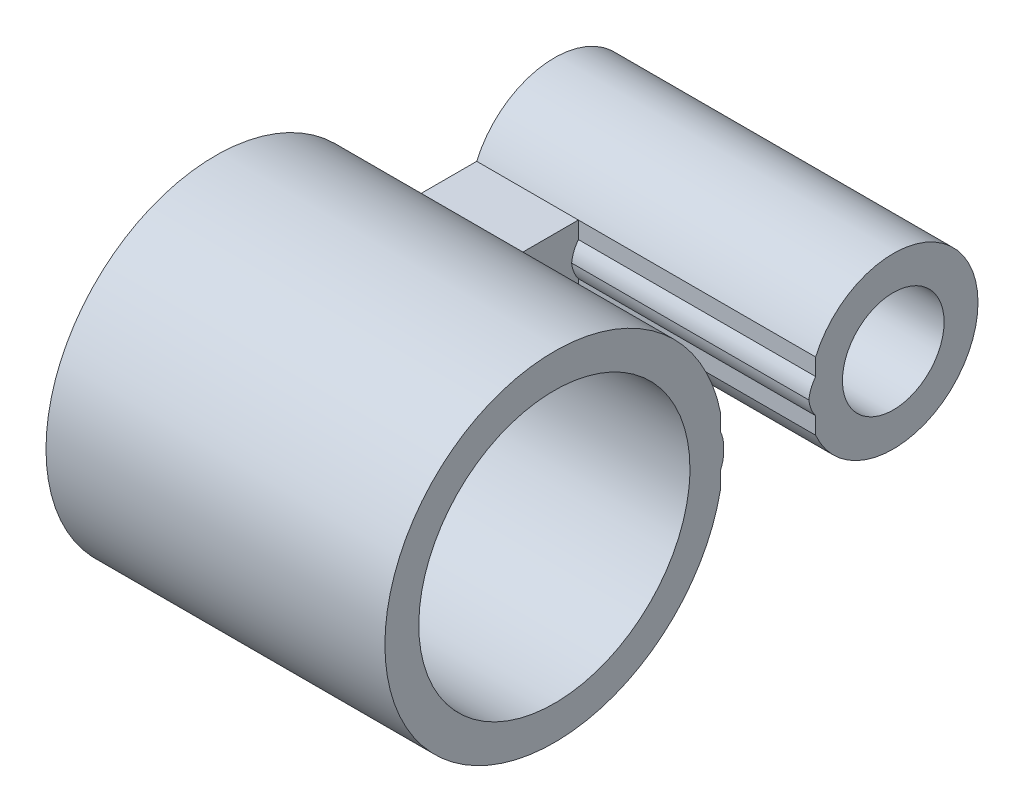
ISO-10303-21;
HEADER;
FILE_DESCRIPTION(('STEP AP214'),'2;1');
FILE_NAME('part.step','',(''),(''),'','','');
FILE_SCHEMA(('AUTOMOTIVE_DESIGN { 1 0 10303 214 1 1 1 1 }'));
ENDSEC;
DATA;
#1=APPLICATION_CONTEXT('core data for automotive mechanical design processes');
#2=APPLICATION_PROTOCOL_DEFINITION('international standard','automotive_design',2000,#1);
#3=PRODUCT_CONTEXT('',#1,'mechanical');
#4=PRODUCT('Part','Part','',(#3));
#5=PRODUCT_RELATED_PRODUCT_CATEGORY('part','',(#4));
#6=PRODUCT_DEFINITION_FORMATION('','',#4);
#7=PRODUCT_DEFINITION_CONTEXT('part definition',#1,'design');
#8=PRODUCT_DEFINITION('design','',#6,#7);
#9=PRODUCT_DEFINITION_SHAPE('','',#8);
#10=(LENGTH_UNIT() NAMED_UNIT(*) SI_UNIT(.MILLI.,.METRE.));
#11=(NAMED_UNIT(*) PLANE_ANGLE_UNIT() SI_UNIT($,.RADIAN.));
#12=(NAMED_UNIT(*) SI_UNIT($,.STERADIAN.) SOLID_ANGLE_UNIT());
#13=UNCERTAINTY_MEASURE_WITH_UNIT(LENGTH_MEASURE(1.E-05),#10,'distance_accuracy_value','');
#14=(GEOMETRIC_REPRESENTATION_CONTEXT(3) GLOBAL_UNCERTAINTY_ASSIGNED_CONTEXT((#13)) GLOBAL_UNIT_ASSIGNED_CONTEXT((#10,
#11,#12)) REPRESENTATION_CONTEXT('',''));
#15=CARTESIAN_POINT('',(0.,0.,0.));
#16=DIRECTION('',(0.,0.,1.));
#17=DIRECTION('',(1.,0.,0.));
#18=AXIS2_PLACEMENT_3D('',#15,#16,#17);
#19=CARTESIAN_POINT('',(10.,-0.500000000000002,0.));
#20=DIRECTION('',(0.,-1.,0.));
#21=DIRECTION('',(0.,0.,-1.));
#22=AXIS2_PLACEMENT_3D('',#19,#20,#21);
#23=PLANE('',#22);
#24=DIRECTION('',(0.,0.,1.));
#25=VECTOR('',#24,1.);
#26=CARTESIAN_POINT('',(2.,-0.500000000000002,0.));
#27=LINE('',#26,#25);
#28=CARTESIAN_POINT('',(2.,-0.500000000000001,-8.58578643762691));
#29=VERTEX_POINT('',#28);
#30=CARTESIAN_POINT('',(2.,-0.500000000000002,-3.96862696659689));
#31=VERTEX_POINT('',#30);
#32=EDGE_CURVE('E268',#29,#31,#27,.T.);
#33=ORIENTED_EDGE('',*,*,#32,.F.);
#34=DIRECTION('',(1.,0.,0.));
#35=VECTOR('',#34,1.);
#36=CARTESIAN_POINT('',(1.,-0.500000000000001,-8.58578643762691));
#37=LINE('',#36,#35);
#38=CARTESIAN_POINT('',(1.,-0.500000000000001,-8.58578643762691));
#39=VERTEX_POINT('',#38);
#40=EDGE_CURVE('E273',#29,#39,#37,.F.);
#41=ORIENTED_EDGE('',*,*,#40,.T.);
#42=DIRECTION('',(0.,0.,-1.));
#43=VECTOR('',#42,1.);
#44=CARTESIAN_POINT('',(0.999999999999999,-0.500000000000002,0.));
#45=LINE('',#44,#43);
#46=CARTESIAN_POINT('',(1.,-0.500000000000002,-3.96862696659689));
#47=VERTEX_POINT('',#46);
#48=EDGE_CURVE('E289',#47,#39,#45,.T.);
#49=ORIENTED_EDGE('',*,*,#48,.F.);
#50=DIRECTION('',(1.,0.,0.));
#51=VECTOR('',#50,1.);
#52=CARTESIAN_POINT('',(1.,-0.500000000000002,-3.96862696659689));
#53=LINE('',#52,#51);
#54=EDGE_CURVE('E277',#47,#31,#53,.T.);
#55=ORIENTED_EDGE('',*,*,#54,.T.);
#56=EDGE_LOOP('',(#33,#41,#49,#55));
#57=FACE_BOUND('',#56,.T.);
#58=ADVANCED_FACE('F35',(#57),#23,.F.);
#59=CARTESIAN_POINT('',(10.,0.5,0.));
#60=DIRECTION('',(0.,1.,0.));
#61=DIRECTION('',(0.,0.,1.));
#62=AXIS2_PLACEMENT_3D('',#59,#60,#61);
#63=PLANE('',#62);
#64=DIRECTION('',(1.,0.,0.));
#65=VECTOR('',#64,1.);
#66=CARTESIAN_POINT('',(1.,0.5,-8.58578643762691));
#67=LINE('',#66,#65);
#68=CARTESIAN_POINT('',(1.,0.5,-8.58578643762691));
#69=VERTEX_POINT('',#68);
#70=CARTESIAN_POINT('',(2.,0.5,-8.58578643762691));
#71=VERTEX_POINT('',#70);
#72=EDGE_CURVE('E270',#69,#71,#67,.T.);
#73=ORIENTED_EDGE('',*,*,#72,.T.);
#74=DIRECTION('',(0.,0.,-1.));
#75=VECTOR('',#74,1.);
#76=CARTESIAN_POINT('',(2.,0.5,0.));
#77=LINE('',#76,#75);
#78=CARTESIAN_POINT('',(2.,0.5,-3.96862696659689));
#79=VERTEX_POINT('',#78);
#80=EDGE_CURVE('E266',#79,#71,#77,.T.);
#81=ORIENTED_EDGE('',*,*,#80,.F.);
#82=DIRECTION('',(1.,0.,0.));
#83=VECTOR('',#82,1.);
#84=CARTESIAN_POINT('',(1.,0.5,-3.96862696659689));
#85=LINE('',#84,#83);
#86=CARTESIAN_POINT('',(1.,0.5,-3.96862696659689));
#87=VERTEX_POINT('',#86);
#88=EDGE_CURVE('E275',#79,#87,#85,.F.);
#89=ORIENTED_EDGE('',*,*,#88,.T.);
#90=DIRECTION('',(0.,0.,1.));
#91=VECTOR('',#90,1.);
#92=CARTESIAN_POINT('',(0.999999999999999,0.5,0.));
#93=LINE('',#92,#91);
#94=EDGE_CURVE('E286',#69,#87,#93,.T.);
#95=ORIENTED_EDGE('',*,*,#94,.F.);
#96=EDGE_LOOP('',(#73,#81,#89,#95));
#97=FACE_BOUND('',#96,.T.);
#98=ADVANCED_FACE('F351',(#97),#63,.F.);
#99=CARTESIAN_POINT('',(10.,-1.,0.));
#100=DIRECTION('',(0.,-1.,0.));
#101=DIRECTION('',(0.,0.,-1.));
#102=AXIS2_PLACEMENT_3D('',#99,#100,#101);
#103=PLANE('',#102);
#104=DIRECTION('',(-1.,0.,0.));
#105=VECTOR('',#104,1.);
#106=CARTESIAN_POINT('',(10.,-1.,-7.70871215252208));
#107=LINE('',#106,#105);
#108=CARTESIAN_POINT('',(3.,-1.,-7.70871215252208));
#109=VERTEX_POINT('',#108);
#110=CARTESIAN_POINT('',(0.,-1.,-7.70871215252208));
#111=VERTEX_POINT('',#110);
#112=EDGE_CURVE('E184',#109,#111,#107,.T.);
#113=ORIENTED_EDGE('',*,*,#112,.F.);
#114=DIRECTION('',(0.,0.,-1.));
#115=VECTOR('',#114,1.);
#116=CARTESIAN_POINT('',(3.,-1.,-4.89897948556636));
#117=LINE('',#116,#115);
#118=CARTESIAN_POINT('',(3.,-1.,-4.89897948556636));
#119=VERTEX_POINT('',#118);
#120=EDGE_CURVE('E172',#119,#109,#117,.T.);
#121=ORIENTED_EDGE('',*,*,#120,.F.);
#122=DIRECTION('',(-1.,0.,0.));
#123=VECTOR('',#122,1.);
#124=CARTESIAN_POINT('',(10.,-1.,-4.89897948556635));
#125=LINE('',#124,#123);
#126=CARTESIAN_POINT('',(0.,-1.,-4.89897948556635));
#127=VERTEX_POINT('',#126);
#128=EDGE_CURVE('E154',#119,#127,#125,.T.);
#129=ORIENTED_EDGE('',*,*,#128,.T.);
#130=DIRECTION('',(0.,0.,1.));
#131=VECTOR('',#130,1.);
#132=CARTESIAN_POINT('',(0.,-1.,0.));
#133=LINE('',#132,#131);
#134=EDGE_CURVE('E292',#111,#127,#133,.T.);
#135=ORIENTED_EDGE('',*,*,#134,.F.);
#136=EDGE_LOOP('',(#113,#121,#129,#135));
#137=FACE_BOUND('',#136,.T.);
#138=ADVANCED_FACE('F183',(#137),#103,.T.);
#139=CARTESIAN_POINT('',(10.,0.999999999999998,0.));
#140=DIRECTION('',(0.,1.,0.));
#141=DIRECTION('',(0.,0.,1.));
#142=AXIS2_PLACEMENT_3D('',#139,#140,#141);
#143=PLANE('',#142);
#144=DIRECTION('',(-1.,0.,0.));
#145=VECTOR('',#144,1.);
#146=CARTESIAN_POINT('',(10.,0.999999999999999,-4.89897948556636));
#147=LINE('',#146,#145);
#148=CARTESIAN_POINT('',(3.,0.999999999999999,-4.89897948556636));
#149=VERTEX_POINT('',#148);
#150=CARTESIAN_POINT('',(0.,0.999999999999999,-4.89897948556636));
#151=VERTEX_POINT('',#150);
#152=EDGE_CURVE('E191',#149,#151,#147,.T.);
#153=ORIENTED_EDGE('',*,*,#152,.F.);
#154=DIRECTION('',(0.,0.,1.));
#155=VECTOR('',#154,1.);
#156=CARTESIAN_POINT('',(3.,0.999999999999999,-4.89897948556636));
#157=LINE('',#156,#155);
#158=CARTESIAN_POINT('',(3.,1.,-7.70871215252208));
#159=VERTEX_POINT('',#158);
#160=EDGE_CURVE('E249',#159,#149,#157,.T.);
#161=ORIENTED_EDGE('',*,*,#160,.F.);
#162=DIRECTION('',(-1.,0.,0.));
#163=VECTOR('',#162,1.);
#164=CARTESIAN_POINT('',(10.,1.,-7.70871215252208));
#165=LINE('',#164,#163);
#166=CARTESIAN_POINT('',(0.,1.,-7.70871215252208));
#167=VERTEX_POINT('',#166);
#168=EDGE_CURVE('E198',#159,#167,#165,.T.);
#169=ORIENTED_EDGE('',*,*,#168,.T.);
#170=DIRECTION('',(0.,0.,-1.));
#171=VECTOR('',#170,1.);
#172=CARTESIAN_POINT('',(0.,0.999999999999998,0.));
#173=LINE('',#172,#171);
#174=EDGE_CURVE('E306',#151,#167,#173,.T.);
#175=ORIENTED_EDGE('',*,*,#174,.F.);
#176=EDGE_LOOP('',(#153,#161,#169,#175));
#177=FACE_BOUND('',#176,.T.);
#178=ADVANCED_FACE('F313',(#177),#143,.T.);
#179=CARTESIAN_POINT('',(10.,0.,0.));
#180=DIRECTION('',(1.,0.,0.));
#181=DIRECTION('',(0.,0.,-1.));
#182=AXIS2_PLACEMENT_3D('',#179,#180,#181);
#183=PLANE('',#182);
#184=CARTESIAN_POINT('',(10.,0.,0.));
#185=DIRECTION('',(1.,0.,0.));
#186=DIRECTION('',(0.,0.,-1.));
#187=AXIS2_PLACEMENT_3D('',#184,#185,#186);
#188=CIRCLE('',#187,4.);
#189=CARTESIAN_POINT('',(10.,0.,-4.));
#190=VERTEX_POINT('',#189);
#191=EDGE_CURVE('E296',#190,#190,#188,.T.);
#192=ORIENTED_EDGE('',*,*,#191,.F.);
#193=EDGE_LOOP('',(#192));
#194=FACE_BOUND('',#193,.T.);
#195=CARTESIAN_POINT('',(10.,0.,0.));
#196=DIRECTION('',(1.,0.,0.));
#197=DIRECTION('',(0.,0.,-1.));
#198=AXIS2_PLACEMENT_3D('',#195,#196,#197);
#199=CIRCLE('',#198,4.99462149866637);
#200=CARTESIAN_POINT('',(10.,-0.0934114048360445,-4.99374791358022));
#201=VERTEX_POINT('',#200);
#202=CARTESIAN_POINT('',(10.,0.0934114048360476,-4.99374791358022));
#203=VERTEX_POINT('',#202);
#204=EDGE_CURVE('E245',#201,#203,#199,.T.);
#205=ORIENTED_EDGE('',*,*,#204,.T.);
#206=CARTESIAN_POINT('',(10.,0.0747090056930916,-3.99392281874298));
#207=DIRECTION('',(1.,0.,0.));
#208=DIRECTION('',(0.,0.,-1.));
#209=AXIS2_PLACEMENT_3D('',#206,#207,#208);
#210=CIRCLE('',#209,1.);
#211=CARTESIAN_POINT('',(10.,0.5,-4.89897948556636));
#212=VERTEX_POINT('',#211);
#213=EDGE_CURVE('E218',#203,#212,#210,.T.);
#214=ORIENTED_EDGE('',*,*,#213,.T.);
#215=DIRECTION('',(0.,-1.,0.));
#216=VECTOR('',#215,1.);
#217=CARTESIAN_POINT('',(10.,0.999999999999999,-4.89897948556636));
#218=LINE('',#217,#216);
#219=CARTESIAN_POINT('',(10.,0.999999999999999,-4.89897948556636));
#220=VERTEX_POINT('',#219);
#221=EDGE_CURVE('E244',#220,#212,#218,.T.);
#222=ORIENTED_EDGE('',*,*,#221,.F.);
#223=CARTESIAN_POINT('',(10.,0.,0.));
#224=DIRECTION('',(1.,0.,0.));
#225=DIRECTION('',(0.,0.,-1.));
#226=AXIS2_PLACEMENT_3D('',#223,#224,#225);
#227=CIRCLE('',#226,5.);
#228=CARTESIAN_POINT('',(10.,-1.,-4.89897948556636));
#229=VERTEX_POINT('',#228);
#230=EDGE_CURVE('E166',#220,#229,#227,.T.);
#231=ORIENTED_EDGE('',*,*,#230,.T.);
#232=DIRECTION('',(0.,-1.,0.));
#233=VECTOR('',#232,1.);
#234=CARTESIAN_POINT('',(10.,0.,-4.89897948556636));
#235=LINE('',#234,#233);
#236=CARTESIAN_POINT('',(10.,-0.500000000000001,-4.89897948556636));
#237=VERTEX_POINT('',#236);
#238=EDGE_CURVE('E189',#237,#229,#235,.T.);
#239=ORIENTED_EDGE('',*,*,#238,.F.);
#240=CARTESIAN_POINT('',(10.,-0.0747090056930891,-3.99392281874298));
#241=DIRECTION('',(1.,0.,0.));
#242=DIRECTION('',(0.,0.,-1.));
#243=AXIS2_PLACEMENT_3D('',#240,#241,#242);
#244=CIRCLE('',#243,1.);
#245=EDGE_CURVE('E216',#237,#201,#244,.T.);
#246=ORIENTED_EDGE('',*,*,#245,.T.);
#247=EDGE_LOOP('',(#205,#214,#222,#231,#239,#246));
#248=FACE_BOUND('',#247,.T.);
#249=ADVANCED_FACE('F243',(#194,#248),#183,.T.);
#250=CARTESIAN_POINT('',(10.,0.,-10.));
#251=DIRECTION('',(-1.,0.,0.));
#252=DIRECTION('',(0.,0.,1.));
#253=AXIS2_PLACEMENT_3D('',#250,#251,#252);
#254=CYLINDRICAL_SURFACE('',#253,1.5);
#255=CARTESIAN_POINT('',(10.,0.,-10.));
#256=DIRECTION('',(1.,0.,0.));
#257=DIRECTION('',(0.,0.,-1.));
#258=AXIS2_PLACEMENT_3D('',#255,#256,#257);
#259=CIRCLE('',#258,1.5);
#260=CARTESIAN_POINT('',(10.,0.,-11.5));
#261=VERTEX_POINT('',#260);
#262=EDGE_CURVE('E293',#261,#261,#259,.T.);
#263=ORIENTED_EDGE('',*,*,#262,.T.);
#264=EDGE_LOOP('',(#263));
#265=FACE_BOUND('',#264,.T.);
#266=CARTESIAN_POINT('',(2.,0.,-10.));
#267=DIRECTION('',(1.,0.,0.));
#268=DIRECTION('',(0.,0.,-1.));
#269=AXIS2_PLACEMENT_3D('',#266,#267,#268);
#270=CIRCLE('',#269,1.5);
#271=EDGE_CURVE('E331',#71,#29,#270,.T.);
#272=ORIENTED_EDGE('',*,*,#271,.F.);
#273=ORIENTED_EDGE('',*,*,#72,.F.);
#274=CARTESIAN_POINT('',(1.,0.,-10.));
#275=DIRECTION('',(-1.,0.,0.));
#276=DIRECTION('',(0.,0.,1.));
#277=AXIS2_PLACEMENT_3D('',#274,#275,#276);
#278=CIRCLE('',#277,1.5);
#279=EDGE_CURVE('E280',#69,#39,#278,.T.);
#280=ORIENTED_EDGE('',*,*,#279,.T.);
#281=ORIENTED_EDGE('',*,*,#40,.F.);
#282=EDGE_LOOP('',(#272,#273,#280,#281));
#283=FACE_BOUND('',#282,.T.);
#284=ADVANCED_FACE('F341',(#265,#283),#254,.F.);
#285=CARTESIAN_POINT('',(10.,0.,0.));
#286=DIRECTION('',(-1.,0.,0.));
#287=DIRECTION('',(0.,0.,1.));
#288=AXIS2_PLACEMENT_3D('',#285,#286,#287);
#289=CYLINDRICAL_SURFACE('',#288,4.);
#290=ORIENTED_EDGE('',*,*,#191,.T.);
#291=EDGE_LOOP('',(#290));
#292=FACE_BOUND('',#291,.T.);
#293=CARTESIAN_POINT('',(2.,0.,0.));
#294=DIRECTION('',(1.,0.,0.));
#295=DIRECTION('',(0.,0.,-1.));
#296=AXIS2_PLACEMENT_3D('',#293,#294,#295);
#297=CIRCLE('',#296,4.);
#298=EDGE_CURVE('E181',#31,#79,#297,.T.);
#299=ORIENTED_EDGE('',*,*,#298,.F.);
#300=ORIENTED_EDGE('',*,*,#54,.F.);
#301=CARTESIAN_POINT('',(1.,0.,0.));
#302=DIRECTION('',(-1.,0.,0.));
#303=DIRECTION('',(0.,0.,1.));
#304=AXIS2_PLACEMENT_3D('',#301,#302,#303);
#305=CIRCLE('',#304,4.);
#306=EDGE_CURVE('E283',#47,#87,#305,.T.);
#307=ORIENTED_EDGE('',*,*,#306,.T.);
#308=ORIENTED_EDGE('',*,*,#88,.F.);
#309=EDGE_LOOP('',(#299,#300,#307,#308));
#310=FACE_BOUND('',#309,.T.);
#311=ADVANCED_FACE('F349',(#292,#310),#289,.F.);
#312=CARTESIAN_POINT('',(10.,0.,-10.));
#313=DIRECTION('',(-1.,0.,0.));
#314=DIRECTION('',(0.,0.,1.));
#315=AXIS2_PLACEMENT_3D('',#312,#313,#314);
#316=CYLINDRICAL_SURFACE('',#315,2.5);
#317=CARTESIAN_POINT('',(0.,0.,-10.));
#318=DIRECTION('',(1.,0.,0.));
#319=DIRECTION('',(0.,0.,-1.));
#320=AXIS2_PLACEMENT_3D('',#317,#318,#319);
#321=CIRCLE('',#320,2.5);
#322=EDGE_CURVE('E304',#111,#167,#321,.T.);
#323=ORIENTED_EDGE('',*,*,#322,.T.);
#324=ORIENTED_EDGE('',*,*,#168,.F.);
#325=CARTESIAN_POINT('',(10.,0.999999999999999,-7.70871215252208));
#326=VERTEX_POINT('',#325);
#327=EDGE_CURVE('E199',#326,#159,#165,.T.);
#328=ORIENTED_EDGE('',*,*,#327,.F.);
#329=CARTESIAN_POINT('',(10.,0.,-10.));
#330=DIRECTION('',(1.,0.,0.));
#331=DIRECTION('',(0.,0.,-1.));
#332=AXIS2_PLACEMENT_3D('',#329,#330,#331);
#333=CIRCLE('',#332,2.5);
#334=CARTESIAN_POINT('',(10.,-1.,-7.70871215252208));
#335=VERTEX_POINT('',#334);
#336=EDGE_CURVE('E299',#335,#326,#333,.T.);
#337=ORIENTED_EDGE('',*,*,#336,.F.);
#338=EDGE_CURVE('E202',#335,#109,#107,.T.);
#339=ORIENTED_EDGE('',*,*,#338,.T.);
#340=ORIENTED_EDGE('',*,*,#112,.T.);
#341=EDGE_LOOP('',(#323,#324,#328,#337,#339,#340));
#342=FACE_BOUND('',#341,.T.);
#343=ADVANCED_FACE('F317',(#342),#316,.T.);
#344=CARTESIAN_POINT('',(10.,0.,0.));
#345=DIRECTION('',(-1.,0.,0.));
#346=DIRECTION('',(0.,0.,1.));
#347=AXIS2_PLACEMENT_3D('',#344,#345,#346);
#348=CYLINDRICAL_SURFACE('',#347,5.);
#349=CARTESIAN_POINT('',(0.,0.,0.));
#350=DIRECTION('',(1.,0.,0.));
#351=DIRECTION('',(0.,0.,-1.));
#352=AXIS2_PLACEMENT_3D('',#349,#350,#351);
#353=CIRCLE('',#352,5.);
#354=EDGE_CURVE('E161',#151,#127,#353,.T.);
#355=ORIENTED_EDGE('',*,*,#354,.T.);
#356=ORIENTED_EDGE('',*,*,#128,.F.);
#357=EDGE_CURVE('E159',#229,#119,#125,.T.);
#358=ORIENTED_EDGE('',*,*,#357,.F.);
#359=ORIENTED_EDGE('',*,*,#230,.F.);
#360=EDGE_CURVE('E192',#220,#149,#147,.T.);
#361=ORIENTED_EDGE('',*,*,#360,.T.);
#362=ORIENTED_EDGE('',*,*,#152,.T.);
#363=EDGE_LOOP('',(#355,#356,#358,#359,#361,#362));
#364=FACE_BOUND('',#363,.T.);
#365=ADVANCED_FACE('F156',(#364),#348,.T.);
#366=ORIENTED_EDGE('',*,*,#262,.F.);
#367=EDGE_LOOP('',(#366));
#368=FACE_BOUND('',#367,.T.);
#369=CARTESIAN_POINT('',(10.,-0.106512124533481,-8.5037863898068));
#370=DIRECTION('',(1.,0.,0.));
#371=DIRECTION('',(0.,0.,-1.));
#372=AXIS2_PLACEMENT_3D('',#369,#370,#371);
#373=CIRCLE('',#372,1.);
#374=CARTESIAN_POINT('',(10.,0.5,-7.70871215252208));
#375=VERTEX_POINT('',#374);
#376=CARTESIAN_POINT('',(10.,0.,-7.50947498620762));
#377=VERTEX_POINT('',#376);
#378=EDGE_CURVE('E57',#375,#377,#373,.T.);
#379=ORIENTED_EDGE('',*,*,#378,.T.);
#380=CARTESIAN_POINT('',(10.,0.10651212453348,-8.5037863898068));
#381=DIRECTION('',(1.,0.,0.));
#382=DIRECTION('',(0.,0.,-1.));
#383=AXIS2_PLACEMENT_3D('',#380,#381,#382);
#384=CIRCLE('',#383,1.);
#385=CARTESIAN_POINT('',(10.,-0.500000000000001,-7.70871215252208));
#386=VERTEX_POINT('',#385);
#387=EDGE_CURVE('E221',#377,#386,#384,.T.);
#388=ORIENTED_EDGE('',*,*,#387,.T.);
#389=DIRECTION('',(0.,1.,0.));
#390=VECTOR('',#389,1.);
#391=CARTESIAN_POINT('',(10.,0.999999999999999,-7.70871215252208));
#392=LINE('',#391,#390);
#393=EDGE_CURVE('E248',#335,#386,#392,.T.);
#394=ORIENTED_EDGE('',*,*,#393,.F.);
#395=ORIENTED_EDGE('',*,*,#336,.T.);
#396=DIRECTION('',(0.,1.,0.));
#397=VECTOR('',#396,1.);
#398=CARTESIAN_POINT('',(10.,0.,-7.70871215252208));
#399=LINE('',#398,#397);
#400=EDGE_CURVE('E205',#375,#326,#399,.T.);
#401=ORIENTED_EDGE('',*,*,#400,.F.);
#402=EDGE_LOOP('',(#379,#388,#394,#395,#401));
#403=FACE_BOUND('',#402,.T.);
#404=ADVANCED_FACE('F323',(#368,#403),#183,.T.);
#405=CARTESIAN_POINT('',(0.,0.,0.));
#406=DIRECTION('',(1.,0.,0.));
#407=DIRECTION('',(0.,0.,-1.));
#408=AXIS2_PLACEMENT_3D('',#405,#406,#407);
#409=PLANE('',#408);
#410=ORIENTED_EDGE('',*,*,#134,.T.);
#411=ORIENTED_EDGE('',*,*,#354,.F.);
#412=ORIENTED_EDGE('',*,*,#174,.T.);
#413=ORIENTED_EDGE('',*,*,#322,.F.);
#414=EDGE_LOOP('',(#410,#411,#412,#413));
#415=FACE_BOUND('',#414,.T.);
#416=ADVANCED_FACE('F311',(#415),#409,.F.);
#417=CARTESIAN_POINT('',(1.,0.,-10.));
#418=DIRECTION('',(-1.,0.,0.));
#419=DIRECTION('',(0.,0.,1.));
#420=AXIS2_PLACEMENT_3D('',#417,#418,#419);
#421=PLANE('',#420);
#422=ORIENTED_EDGE('',*,*,#48,.T.);
#423=ORIENTED_EDGE('',*,*,#279,.F.);
#424=ORIENTED_EDGE('',*,*,#94,.T.);
#425=ORIENTED_EDGE('',*,*,#306,.F.);
#426=EDGE_LOOP('',(#422,#423,#424,#425));
#427=FACE_BOUND('',#426,.T.);
#428=ADVANCED_FACE('F353',(#427),#421,.F.);
#429=CARTESIAN_POINT('',(2.,0.999999999999999,-7.70871215252208));
#430=DIRECTION('',(0.,0.,-1.));
#431=DIRECTION('',(-1.,0.,0.));
#432=AXIS2_PLACEMENT_3D('',#429,#430,#431);
#433=PLANE('',#432);
#434=ORIENTED_EDGE('',*,*,#327,.T.);
#435=DIRECTION('',(0.,1.,0.));
#436=VECTOR('',#435,1.);
#437=CARTESIAN_POINT('',(3.,0.999999999999999,-7.70871215252208));
#438=LINE('',#437,#436);
#439=CARTESIAN_POINT('',(3.,0.5,-7.70871215252208));
#440=VERTEX_POINT('',#439);
#441=EDGE_CURVE('E185',#440,#159,#438,.T.);
#442=ORIENTED_EDGE('',*,*,#441,.F.);
#443=DIRECTION('',(-1.,0.,0.));
#444=VECTOR('',#443,1.);
#445=CARTESIAN_POINT('',(10.,0.5,-7.70871215252208));
#446=LINE('',#445,#444);
#447=EDGE_CURVE('E252',#375,#440,#446,.T.);
#448=ORIENTED_EDGE('',*,*,#447,.F.);
#449=ORIENTED_EDGE('',*,*,#400,.T.);
#450=EDGE_LOOP('',(#434,#442,#448,#449));
#451=FACE_BOUND('',#450,.T.);
#452=ADVANCED_FACE('F355',(#451),#433,.F.);
#453=CARTESIAN_POINT('',(2.,0.999999999999999,-4.89897948556636));
#454=DIRECTION('',(0.,0.,1.));
#455=DIRECTION('',(1.,0.,0.));
#456=AXIS2_PLACEMENT_3D('',#453,#454,#455);
#457=PLANE('',#456);
#458=DIRECTION('',(1.,0.,0.));
#459=VECTOR('',#458,1.);
#460=CARTESIAN_POINT('',(10.,0.5,-4.89897948556636));
#461=LINE('',#460,#459);
#462=CARTESIAN_POINT('',(3.,0.5,-4.89897948556636));
#463=VERTEX_POINT('',#462);
#464=EDGE_CURVE('E239',#463,#212,#461,.T.);
#465=ORIENTED_EDGE('',*,*,#464,.F.);
#466=DIRECTION('',(0.,-1.,0.));
#467=VECTOR('',#466,1.);
#468=CARTESIAN_POINT('',(3.,0.999999999999999,-4.89897948556636));
#469=LINE('',#468,#467);
#470=EDGE_CURVE('E180',#149,#463,#469,.T.);
#471=ORIENTED_EDGE('',*,*,#470,.F.);
#472=ORIENTED_EDGE('',*,*,#360,.F.);
#473=ORIENTED_EDGE('',*,*,#221,.T.);
#474=EDGE_LOOP('',(#465,#471,#472,#473));
#475=FACE_BOUND('',#474,.T.);
#476=ADVANCED_FACE('F247',(#475),#457,.F.);
#477=ORIENTED_EDGE('',*,*,#357,.T.);
#478=CARTESIAN_POINT('',(3.,-0.500000000000001,-4.89897948556636));
#479=VERTEX_POINT('',#478);
#480=EDGE_CURVE('E170',#479,#119,#469,.T.);
#481=ORIENTED_EDGE('',*,*,#480,.F.);
#482=DIRECTION('',(-1.,0.,0.));
#483=VECTOR('',#482,1.);
#484=CARTESIAN_POINT('',(10.,-0.500000000000001,-4.89897948556636));
#485=LINE('',#484,#483);
#486=EDGE_CURVE('E264',#237,#479,#485,.T.);
#487=ORIENTED_EDGE('',*,*,#486,.F.);
#488=ORIENTED_EDGE('',*,*,#238,.T.);
#489=EDGE_LOOP('',(#477,#481,#487,#488));
#490=FACE_BOUND('',#489,.T.);
#491=ADVANCED_FACE('F187',(#490),#457,.F.);
#492=DIRECTION('',(1.,0.,0.));
#493=VECTOR('',#492,1.);
#494=CARTESIAN_POINT('',(10.,-0.500000000000001,-7.70871215252208));
#495=LINE('',#494,#493);
#496=CARTESIAN_POINT('',(3.,-0.500000000000001,-7.70871215252208));
#497=VERTEX_POINT('',#496);
#498=EDGE_CURVE('E260',#497,#386,#495,.T.);
#499=ORIENTED_EDGE('',*,*,#498,.F.);
#500=EDGE_CURVE('E254',#109,#497,#438,.T.);
#501=ORIENTED_EDGE('',*,*,#500,.F.);
#502=ORIENTED_EDGE('',*,*,#338,.F.);
#503=ORIENTED_EDGE('',*,*,#393,.T.);
#504=EDGE_LOOP('',(#499,#501,#502,#503));
#505=FACE_BOUND('',#504,.T.);
#506=ADVANCED_FACE('F322',(#505),#433,.F.);
#507=CARTESIAN_POINT('',(2.,0.,0.));
#508=DIRECTION('',(1.,0.,0.));
#509=DIRECTION('',(0.,0.,-1.));
#510=AXIS2_PLACEMENT_3D('',#507,#508,#509);
#511=PLANE('',#510);
#512=ORIENTED_EDGE('',*,*,#80,.T.);
#513=ORIENTED_EDGE('',*,*,#271,.T.);
#514=ORIENTED_EDGE('',*,*,#32,.T.);
#515=ORIENTED_EDGE('',*,*,#298,.T.);
#516=EDGE_LOOP('',(#512,#513,#514,#515));
#517=FACE_BOUND('',#516,.T.);
#518=ADVANCED_FACE('F337',(#517),#511,.F.);
#519=CARTESIAN_POINT('',(3.,0.,0.));
#520=DIRECTION('',(1.,0.,0.));
#521=DIRECTION('',(0.,0.,-1.));
#522=AXIS2_PLACEMENT_3D('',#519,#520,#521);
#523=PLANE('',#522);
#524=CARTESIAN_POINT('',(3.,0.10651212453348,-8.5037863898068));
#525=DIRECTION('',(1.,0.,0.));
#526=DIRECTION('',(0.,0.,-1.));
#527=AXIS2_PLACEMENT_3D('',#524,#525,#526);
#528=CIRCLE('',#527,1.);
#529=CARTESIAN_POINT('',(3.,0.,-7.50947498620762));
#530=VERTEX_POINT('',#529);
#531=EDGE_CURVE('E44',#497,#530,#528,.F.);
#532=ORIENTED_EDGE('',*,*,#531,.T.);
#533=CARTESIAN_POINT('',(3.,-0.106512124533481,-8.5037863898068));
#534=DIRECTION('',(1.,0.,0.));
#535=DIRECTION('',(0.,0.,-1.));
#536=AXIS2_PLACEMENT_3D('',#533,#534,#535);
#537=CIRCLE('',#536,1.);
#538=EDGE_CURVE('E11',#530,#440,#537,.F.);
#539=ORIENTED_EDGE('',*,*,#538,.T.);
#540=ORIENTED_EDGE('',*,*,#441,.T.);
#541=ORIENTED_EDGE('',*,*,#160,.T.);
#542=ORIENTED_EDGE('',*,*,#470,.T.);
#543=CARTESIAN_POINT('',(3.,0.0747090056930916,-3.99392281874298));
#544=DIRECTION('',(1.,0.,0.));
#545=DIRECTION('',(0.,0.,-1.));
#546=AXIS2_PLACEMENT_3D('',#543,#544,#545);
#547=CIRCLE('',#546,1.);
#548=CARTESIAN_POINT('',(3.,0.0934114048360476,-4.99374791358022));
#549=VERTEX_POINT('',#548);
#550=EDGE_CURVE('E223',#463,#549,#547,.F.);
#551=ORIENTED_EDGE('',*,*,#550,.T.);
#552=CARTESIAN_POINT('',(3.,0.,0.));
#553=DIRECTION('',(1.,0.,0.));
#554=DIRECTION('',(0.,0.,-1.));
#555=AXIS2_PLACEMENT_3D('',#552,#553,#554);
#556=CIRCLE('',#555,4.99462149866637);
#557=CARTESIAN_POINT('',(3.,-0.0934114048360445,-4.99374791358022));
#558=VERTEX_POINT('',#557);
#559=EDGE_CURVE('E208',#558,#549,#556,.T.);
#560=ORIENTED_EDGE('',*,*,#559,.F.);
#561=CARTESIAN_POINT('',(3.,-0.0747090056930891,-3.99392281874298));
#562=DIRECTION('',(1.,0.,0.));
#563=DIRECTION('',(0.,0.,-1.));
#564=AXIS2_PLACEMENT_3D('',#561,#562,#563);
#565=CIRCLE('',#564,1.);
#566=EDGE_CURVE('E176',#558,#479,#565,.F.);
#567=ORIENTED_EDGE('',*,*,#566,.T.);
#568=ORIENTED_EDGE('',*,*,#480,.T.);
#569=ORIENTED_EDGE('',*,*,#120,.T.);
#570=ORIENTED_EDGE('',*,*,#500,.T.);
#571=EDGE_LOOP('',(#532,#539,#540,#541,#542,#551,#560,#567,#568,#569,#570));
#572=FACE_BOUND('',#571,.T.);
#573=ADVANCED_FACE('F171',(#572),#523,.T.);
#574=CARTESIAN_POINT('',(2.,0.,0.));
#575=DIRECTION('',(1.,0.,0.));
#576=DIRECTION('',(0.,0.,-1.));
#577=AXIS2_PLACEMENT_3D('',#574,#575,#576);
#578=CYLINDRICAL_SURFACE('',#577,4.99462149866637);
#579=ORIENTED_EDGE('',*,*,#559,.T.);
#580=DIRECTION('',(1.,0.,0.));
#581=VECTOR('',#580,1.);
#582=CARTESIAN_POINT('',(2.,0.0934114048360476,-4.99374791358022));
#583=LINE('',#582,#581);
#584=EDGE_CURVE('E213',#549,#203,#583,.T.);
#585=ORIENTED_EDGE('',*,*,#584,.T.);
#586=ORIENTED_EDGE('',*,*,#204,.F.);
#587=DIRECTION('',(1.,0.,0.));
#588=VECTOR('',#587,1.);
#589=CARTESIAN_POINT('',(2.,-0.0934114048360445,-4.99374791358022));
#590=LINE('',#589,#588);
#591=EDGE_CURVE('E211',#201,#558,#590,.F.);
#592=ORIENTED_EDGE('',*,*,#591,.T.);
#593=EDGE_LOOP('',(#579,#585,#586,#592));
#594=FACE_BOUND('',#593,.T.);
#595=ADVANCED_FACE('F234',(#594),#578,.T.);
#596=CARTESIAN_POINT('',(2.,0.0747090056930916,-3.99392281874298));
#597=DIRECTION('',(-1.,0.,0.));
#598=DIRECTION('',(0.,0.,1.));
#599=AXIS2_PLACEMENT_3D('',#596,#597,#598);
#600=CYLINDRICAL_SURFACE('',#599,1.);
#601=ORIENTED_EDGE('',*,*,#550,.F.);
#602=ORIENTED_EDGE('',*,*,#464,.T.);
#603=ORIENTED_EDGE('',*,*,#213,.F.);
#604=ORIENTED_EDGE('',*,*,#584,.F.);
#605=EDGE_LOOP('',(#601,#602,#603,#604));
#606=FACE_BOUND('',#605,.T.);
#607=ADVANCED_FACE('F238',(#606),#600,.T.);
#608=CARTESIAN_POINT('',(2.,-0.0747090056930891,-3.99392281874298));
#609=DIRECTION('',(-1.,0.,0.));
#610=DIRECTION('',(0.,0.,1.));
#611=AXIS2_PLACEMENT_3D('',#608,#609,#610);
#612=CYLINDRICAL_SURFACE('',#611,1.);
#613=ORIENTED_EDGE('',*,*,#566,.F.);
#614=ORIENTED_EDGE('',*,*,#591,.F.);
#615=ORIENTED_EDGE('',*,*,#245,.F.);
#616=ORIENTED_EDGE('',*,*,#486,.T.);
#617=EDGE_LOOP('',(#613,#614,#615,#616));
#618=FACE_BOUND('',#617,.T.);
#619=ADVANCED_FACE('F379',(#618),#612,.T.);
#620=CARTESIAN_POINT('',(2.,-0.106512124533481,-8.5037863898068));
#621=DIRECTION('',(-1.,0.,0.));
#622=DIRECTION('',(0.,0.,1.));
#623=AXIS2_PLACEMENT_3D('',#620,#621,#622);
#624=CYLINDRICAL_SURFACE('',#623,1.);
#625=ORIENTED_EDGE('',*,*,#447,.T.);
#626=ORIENTED_EDGE('',*,*,#538,.F.);
#627=DIRECTION('',(-1.,0.,0.));
#628=VECTOR('',#627,1.);
#629=CARTESIAN_POINT('',(6.5,0.,-7.50947498620762));
#630=LINE('',#629,#628);
#631=EDGE_CURVE('E39',#377,#530,#630,.T.);
#632=ORIENTED_EDGE('',*,*,#631,.F.);
#633=ORIENTED_EDGE('',*,*,#378,.F.);
#634=EDGE_LOOP('',(#625,#626,#632,#633));
#635=FACE_BOUND('',#634,.T.);
#636=ADVANCED_FACE('F37',(#635),#624,.T.);
#637=CARTESIAN_POINT('',(2.,0.10651212453348,-8.5037863898068));
#638=DIRECTION('',(-1.,0.,0.));
#639=DIRECTION('',(0.,0.,1.));
#640=AXIS2_PLACEMENT_3D('',#637,#638,#639);
#641=CYLINDRICAL_SURFACE('',#640,1.);
#642=ORIENTED_EDGE('',*,*,#531,.F.);
#643=ORIENTED_EDGE('',*,*,#498,.T.);
#644=ORIENTED_EDGE('',*,*,#387,.F.);
#645=ORIENTED_EDGE('',*,*,#631,.T.);
#646=EDGE_LOOP('',(#642,#643,#644,#645));
#647=FACE_BOUND('',#646,.T.);
#648=ADVANCED_FACE('F327',(#647),#641,.T.);
#649=CLOSED_SHELL('',(#58,#98,#138,#178,#249,#284,#311,#343,#365,#404,#416,#428,#452,#476,#491,
#506,#518,#573,#595,#607,#619,#636,#648));
#650=MANIFOLD_SOLID_BREP('B2',#649);
#651=ADVANCED_BREP_SHAPE_REPRESENTATION('',(#18,#650),#14);
#652=SHAPE_DEFINITION_REPRESENTATION(#9,#651);
ENDSEC;
END-ISO-10303-21;
